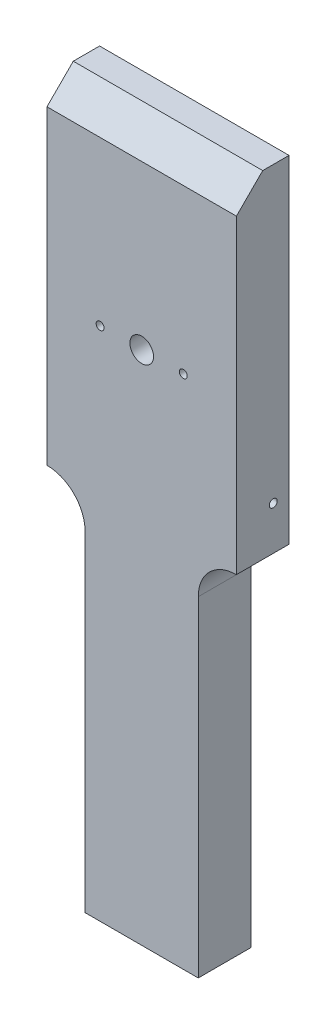
ISO-10303-21;
HEADER;
FILE_DESCRIPTION(('STEP AP214'),'2;1');
FILE_NAME('part.step','',(''),(''),'','','');
FILE_SCHEMA(('AUTOMOTIVE_DESIGN { 1 0 10303 214 1 1 1 1 }'));
ENDSEC;
DATA;
#1=APPLICATION_CONTEXT('core data for automotive mechanical design processes');
#2=APPLICATION_PROTOCOL_DEFINITION('international standard','automotive_design',2000,#1);
#3=PRODUCT_CONTEXT('',#1,'mechanical');
#4=PRODUCT('Part','Part','',(#3));
#5=PRODUCT_RELATED_PRODUCT_CATEGORY('part','',(#4));
#6=PRODUCT_DEFINITION_FORMATION('','',#4);
#7=PRODUCT_DEFINITION_CONTEXT('part definition',#1,'design');
#8=PRODUCT_DEFINITION('design','',#6,#7);
#9=PRODUCT_DEFINITION_SHAPE('','',#8);
#10=(LENGTH_UNIT() NAMED_UNIT(*) SI_UNIT(.MILLI.,.METRE.));
#11=(NAMED_UNIT(*) PLANE_ANGLE_UNIT() SI_UNIT($,.RADIAN.));
#12=(NAMED_UNIT(*) SI_UNIT($,.STERADIAN.) SOLID_ANGLE_UNIT());
#13=UNCERTAINTY_MEASURE_WITH_UNIT(LENGTH_MEASURE(1.E-05),#10,'distance_accuracy_value','');
#14=(GEOMETRIC_REPRESENTATION_CONTEXT(3) GLOBAL_UNCERTAINTY_ASSIGNED_CONTEXT((#13)) GLOBAL_UNIT_ASSIGNED_CONTEXT((#10,
#11,#12)) REPRESENTATION_CONTEXT('',''));
#15=CARTESIAN_POINT('',(0.,0.,0.));
#16=DIRECTION('',(0.,0.,1.));
#17=DIRECTION('',(1.,0.,0.));
#18=AXIS2_PLACEMENT_3D('',#15,#16,#17);
#19=CARTESIAN_POINT('',(0.,-647.7,63.5));
#20=DIRECTION('',(0.,1.,0.));
#21=DIRECTION('',(0.,0.,1.));
#22=AXIS2_PLACEMENT_3D('',#19,#20,#21);
#23=PLANE('',#22);
#24=DIRECTION('',(1.,0.,0.));
#25=VECTOR('',#24,1.);
#26=CARTESIAN_POINT('',(0.,-647.7,0.));
#27=LINE('',#26,#25);
#28=CARTESIAN_POINT('',(-68.2625,-647.7,0.));
#29=VERTEX_POINT('',#28);
#30=CARTESIAN_POINT('',(68.2625,-647.7,0.));
#31=VERTEX_POINT('',#30);
#32=EDGE_CURVE('E255',#29,#31,#27,.T.);
#33=ORIENTED_EDGE('',*,*,#32,.T.);
#34=DIRECTION('',(0.,0.,-1.));
#35=VECTOR('',#34,1.);
#36=CARTESIAN_POINT('',(68.2625,-647.7,63.5));
#37=LINE('',#36,#35);
#38=CARTESIAN_POINT('',(68.2625,-647.7,63.5));
#39=VERTEX_POINT('',#38);
#40=EDGE_CURVE('E265',#39,#31,#37,.T.);
#41=ORIENTED_EDGE('',*,*,#40,.F.);
#42=DIRECTION('',(1.,0.,0.));
#43=VECTOR('',#42,1.);
#44=CARTESIAN_POINT('',(0.,-647.7,63.5));
#45=LINE('',#44,#43);
#46=CARTESIAN_POINT('',(-68.2625,-647.7,63.5));
#47=VERTEX_POINT('',#46);
#48=EDGE_CURVE('E244',#47,#39,#45,.T.);
#49=ORIENTED_EDGE('',*,*,#48,.F.);
#50=DIRECTION('',(0.,0.,-1.));
#51=VECTOR('',#50,1.);
#52=CARTESIAN_POINT('',(-68.2625,-647.7,63.5));
#53=LINE('',#52,#51);
#54=EDGE_CURVE('E254',#47,#29,#53,.T.);
#55=ORIENTED_EDGE('',*,*,#54,.T.);
#56=EDGE_LOOP('',(#33,#41,#49,#55));
#57=FACE_BOUND('',#56,.T.);
#58=ADVANCED_FACE('F105',(#57),#23,.F.);
#59=CARTESIAN_POINT('',(68.2625,0.,63.5));
#60=DIRECTION('',(-1.,0.,0.));
#61=DIRECTION('',(0.,0.,1.));
#62=AXIS2_PLACEMENT_3D('',#59,#60,#61);
#63=PLANE('',#62);
#64=DIRECTION('',(0.,1.,0.));
#65=VECTOR('',#64,1.);
#66=CARTESIAN_POINT('',(68.2625,0.,0.));
#67=LINE('',#66,#65);
#68=CARTESIAN_POINT('',(68.2625,-249.2375,0.));
#69=VERTEX_POINT('',#68);
#70=EDGE_CURVE('E258',#31,#69,#67,.T.);
#71=ORIENTED_EDGE('',*,*,#70,.T.);
#72=DIRECTION('',(0.,0.,-1.));
#73=VECTOR('',#72,1.);
#74=CARTESIAN_POINT('',(68.2625,-249.2375,63.5));
#75=LINE('',#74,#73);
#76=CARTESIAN_POINT('',(68.2625,-249.2375,63.5));
#77=VERTEX_POINT('',#76);
#78=EDGE_CURVE('E268',#69,#77,#75,.F.);
#79=ORIENTED_EDGE('',*,*,#78,.T.);
#80=DIRECTION('',(0.,1.,0.));
#81=VECTOR('',#80,1.);
#82=CARTESIAN_POINT('',(68.2625,0.,63.5));
#83=LINE('',#82,#81);
#84=EDGE_CURVE('E247',#39,#77,#83,.T.);
#85=ORIENTED_EDGE('',*,*,#84,.F.);
#86=ORIENTED_EDGE('',*,*,#40,.T.);
#87=EDGE_LOOP('',(#71,#79,#85,#86));
#88=FACE_BOUND('',#87,.T.);
#89=ADVANCED_FACE('F397',(#88),#63,.F.);
#90=CARTESIAN_POINT('',(-68.2625,0.,63.5));
#91=DIRECTION('',(-1.,0.,0.));
#92=DIRECTION('',(0.,0.,1.));
#93=AXIS2_PLACEMENT_3D('',#90,#91,#92);
#94=PLANE('',#93);
#95=DIRECTION('',(0.,1.,0.));
#96=VECTOR('',#95,1.);
#97=CARTESIAN_POINT('',(-68.2625,0.,63.5));
#98=LINE('',#97,#96);
#99=CARTESIAN_POINT('',(-68.2625,-249.2375,63.5));
#100=VERTEX_POINT('',#99);
#101=EDGE_CURVE('E251',#47,#100,#98,.T.);
#102=ORIENTED_EDGE('',*,*,#101,.T.);
#103=DIRECTION('',(0.,0.,-1.));
#104=VECTOR('',#103,1.);
#105=CARTESIAN_POINT('',(-68.2625,-249.2375,0.));
#106=LINE('',#105,#104);
#107=CARTESIAN_POINT('',(-68.2625,-249.2375,0.));
#108=VERTEX_POINT('',#107);
#109=EDGE_CURVE('E313',#100,#108,#106,.T.);
#110=ORIENTED_EDGE('',*,*,#109,.T.);
#111=DIRECTION('',(0.,1.,0.));
#112=VECTOR('',#111,1.);
#113=CARTESIAN_POINT('',(-68.2625,0.,0.));
#114=LINE('',#113,#112);
#115=EDGE_CURVE('E248',#29,#108,#114,.T.);
#116=ORIENTED_EDGE('',*,*,#115,.F.);
#117=ORIENTED_EDGE('',*,*,#54,.F.);
#118=EDGE_LOOP('',(#102,#110,#116,#117));
#119=FACE_BOUND('',#118,.T.);
#120=ADVANCED_FACE('F344',(#119),#94,.T.);
#121=CARTESIAN_POINT('',(0.,0.,63.5));
#122=DIRECTION('',(0.,0.,1.));
#123=DIRECTION('',(1.,0.,0.));
#124=AXIS2_PLACEMENT_3D('',#121,#122,#123);
#125=PLANE('',#124);
#126=DIRECTION('',(0.,-1.,0.));
#127=VECTOR('',#126,1.);
#128=CARTESIAN_POINT('',(114.3,203.2,63.5));
#129=LINE('',#128,#127);
#130=CARTESIAN_POINT('',(114.3,171.45,63.5));
#131=VERTEX_POINT('',#130);
#132=CARTESIAN_POINT('',(114.3,-203.2,63.5));
#133=VERTEX_POINT('',#132);
#134=EDGE_CURVE('E289',#131,#133,#129,.T.);
#135=ORIENTED_EDGE('',*,*,#134,.F.);
#136=DIRECTION('',(-1.,0.,0.));
#137=VECTOR('',#136,1.);
#138=CARTESIAN_POINT('',(-114.3,171.45,63.5));
#139=LINE('',#138,#137);
#140=CARTESIAN_POINT('',(-114.3,171.45,63.5));
#141=VERTEX_POINT('',#140);
#142=EDGE_CURVE('E325',#131,#141,#139,.T.);
#143=ORIENTED_EDGE('',*,*,#142,.T.);
#144=DIRECTION('',(0.,-1.,0.));
#145=VECTOR('',#144,1.);
#146=CARTESIAN_POINT('',(-114.3,203.2,63.5));
#147=LINE('',#146,#145);
#148=CARTESIAN_POINT('',(-114.3,-203.2,63.5));
#149=VERTEX_POINT('',#148);
#150=EDGE_CURVE('E287',#141,#149,#147,.T.);
#151=ORIENTED_EDGE('',*,*,#150,.T.);
#152=CARTESIAN_POINT('',(-114.3,-249.2375,63.5));
#153=DIRECTION('',(0.,0.,1.));
#154=DIRECTION('',(1.,0.,0.));
#155=AXIS2_PLACEMENT_3D('',#152,#153,#154);
#156=CIRCLE('',#155,46.0375);
#157=EDGE_CURVE('E323',#149,#100,#156,.F.);
#158=ORIENTED_EDGE('',*,*,#157,.T.);
#159=ORIENTED_EDGE('',*,*,#101,.F.);
#160=ORIENTED_EDGE('',*,*,#48,.T.);
#161=ORIENTED_EDGE('',*,*,#84,.T.);
#162=CARTESIAN_POINT('',(114.3,-249.2375,63.5));
#163=DIRECTION('',(0.,0.,1.));
#164=DIRECTION('',(1.,0.,0.));
#165=AXIS2_PLACEMENT_3D('',#162,#163,#164);
#166=CIRCLE('',#165,46.0375);
#167=EDGE_CURVE('E318',#77,#133,#166,.F.);
#168=ORIENTED_EDGE('',*,*,#167,.T.);
#169=EDGE_LOOP('',(#135,#143,#151,#158,#159,#160,#161,#168));
#170=FACE_BOUND('',#169,.T.);
#171=CARTESIAN_POINT('',(-50.1740938230278,-25.3999999999999,63.5));
#172=DIRECTION('',(0.,0.,1.));
#173=DIRECTION('',(1.,0.,0.));
#174=AXIS2_PLACEMENT_3D('',#171,#172,#173);
#175=CIRCLE('',#174,4.7625);
#176=CARTESIAN_POINT('',(-45.4115938230278,-25.3999999999999,63.5));
#177=VERTEX_POINT('',#176);
#178=EDGE_CURVE('E275',#177,#177,#175,.T.);
#179=ORIENTED_EDGE('',*,*,#178,.F.);
#180=EDGE_LOOP('',(#179));
#181=FACE_BOUND('',#180,.T.);
#182=CARTESIAN_POINT('',(0.,-25.3999999999999,63.5));
#183=DIRECTION('',(0.,0.,1.));
#184=DIRECTION('',(1.,0.,0.));
#185=AXIS2_PLACEMENT_3D('',#182,#183,#184);
#186=CIRCLE('',#185,14.2875);
#187=CARTESIAN_POINT('',(14.2875,-25.3999999999999,63.5));
#188=VERTEX_POINT('',#187);
#189=EDGE_CURVE('E281',#188,#188,#186,.T.);
#190=ORIENTED_EDGE('',*,*,#189,.F.);
#191=EDGE_LOOP('',(#190));
#192=FACE_BOUND('',#191,.T.);
#193=CARTESIAN_POINT('',(50.1740938230278,-25.3999999999999,63.5));
#194=DIRECTION('',(0.,0.,1.));
#195=DIRECTION('',(1.,0.,0.));
#196=AXIS2_PLACEMENT_3D('',#193,#194,#195);
#197=CIRCLE('',#196,4.7625);
#198=CARTESIAN_POINT('',(54.9365938230278,-25.3999999999999,63.5));
#199=VERTEX_POINT('',#198);
#200=EDGE_CURVE('E269',#199,#199,#197,.T.);
#201=ORIENTED_EDGE('',*,*,#200,.F.);
#202=EDGE_LOOP('',(#201));
#203=FACE_BOUND('',#202,.T.);
#204=ADVANCED_FACE('F331',(#170,#181,#192,#203),#125,.T.);
#205=CARTESIAN_POINT('',(0.,0.,0.));
#206=DIRECTION('',(0.,0.,1.));
#207=DIRECTION('',(1.,0.,0.));
#208=AXIS2_PLACEMENT_3D('',#205,#206,#207);
#209=PLANE('',#208);
#210=DIRECTION('',(1.,0.,0.));
#211=VECTOR('',#210,1.);
#212=CARTESIAN_POINT('',(19.0499999999999,-128.5875,0.));
#213=LINE('',#212,#211);
#214=CARTESIAN_POINT('',(-19.0500000000001,-128.5875,0.));
#215=VERTEX_POINT('',#214);
#216=CARTESIAN_POINT('',(19.0499999999999,-128.5875,0.));
#217=VERTEX_POINT('',#216);
#218=EDGE_CURVE('E234',#215,#217,#213,.T.);
#219=ORIENTED_EDGE('',*,*,#218,.F.);
#220=DIRECTION('',(0.,1.,0.));
#221=VECTOR('',#220,1.);
#222=CARTESIAN_POINT('',(-19.0500000000001,-128.5875,0.));
#223=LINE('',#222,#221);
#224=CARTESIAN_POINT('',(-19.0500000000002,-623.8875,0.));
#225=VERTEX_POINT('',#224);
#226=EDGE_CURVE('E205',#225,#215,#223,.T.);
#227=ORIENTED_EDGE('',*,*,#226,.F.);
#228=DIRECTION('',(-1.,0.,0.));
#229=VECTOR('',#228,1.);
#230=CARTESIAN_POINT('',(19.0499999999998,-623.8875,0.));
#231=LINE('',#230,#229);
#232=CARTESIAN_POINT('',(19.0499999999998,-623.8875,0.));
#233=VERTEX_POINT('',#232);
#234=EDGE_CURVE('E222',#233,#225,#231,.T.);
#235=ORIENTED_EDGE('',*,*,#234,.F.);
#236=DIRECTION('',(0.,-1.,0.));
#237=VECTOR('',#236,1.);
#238=CARTESIAN_POINT('',(19.0499999999999,-128.5875,0.));
#239=LINE('',#238,#237);
#240=EDGE_CURVE('E225',#217,#233,#239,.T.);
#241=ORIENTED_EDGE('',*,*,#240,.F.);
#242=EDGE_LOOP('',(#219,#227,#235,#241));
#243=FACE_BOUND('',#242,.T.);
#244=ORIENTED_EDGE('',*,*,#32,.F.);
#245=ORIENTED_EDGE('',*,*,#115,.T.);
#246=CARTESIAN_POINT('',(-114.3,-249.2375,0.));
#247=DIRECTION('',(0.,0.,1.));
#248=DIRECTION('',(1.,0.,0.));
#249=AXIS2_PLACEMENT_3D('',#246,#247,#248);
#250=CIRCLE('',#249,46.0375);
#251=CARTESIAN_POINT('',(-114.3,-203.2,0.));
#252=VERTEX_POINT('',#251);
#253=EDGE_CURVE('E321',#108,#252,#250,.T.);
#254=ORIENTED_EDGE('',*,*,#253,.T.);
#255=DIRECTION('',(0.,-1.,0.));
#256=VECTOR('',#255,1.);
#257=CARTESIAN_POINT('',(-114.3,203.2,0.));
#258=LINE('',#257,#256);
#259=CARTESIAN_POINT('',(-114.3,203.2,0.));
#260=VERTEX_POINT('',#259);
#261=EDGE_CURVE('E295',#260,#252,#258,.T.);
#262=ORIENTED_EDGE('',*,*,#261,.F.);
#263=DIRECTION('',(-1.,0.,0.));
#264=VECTOR('',#263,1.);
#265=CARTESIAN_POINT('',(114.3,203.2,0.));
#266=LINE('',#265,#264);
#267=CARTESIAN_POINT('',(114.3,203.2,0.));
#268=VERTEX_POINT('',#267);
#269=EDGE_CURVE('E284',#268,#260,#266,.T.);
#270=ORIENTED_EDGE('',*,*,#269,.F.);
#271=DIRECTION('',(0.,-1.,0.));
#272=VECTOR('',#271,1.);
#273=CARTESIAN_POINT('',(114.3,203.2,0.));
#274=LINE('',#273,#272);
#275=CARTESIAN_POINT('',(114.3,-203.2,0.));
#276=VERTEX_POINT('',#275);
#277=EDGE_CURVE('E290',#268,#276,#274,.T.);
#278=ORIENTED_EDGE('',*,*,#277,.T.);
#279=CARTESIAN_POINT('',(114.3,-249.2375,0.));
#280=DIRECTION('',(0.,0.,1.));
#281=DIRECTION('',(1.,0.,0.));
#282=AXIS2_PLACEMENT_3D('',#279,#280,#281);
#283=CIRCLE('',#282,46.0375);
#284=EDGE_CURVE('E316',#276,#69,#283,.T.);
#285=ORIENTED_EDGE('',*,*,#284,.T.);
#286=ORIENTED_EDGE('',*,*,#70,.F.);
#287=EDGE_LOOP('',(#244,#245,#254,#262,#270,#278,#285,#286));
#288=FACE_BOUND('',#287,.T.);
#289=CARTESIAN_POINT('',(0.,-25.3999999999999,0.));
#290=DIRECTION('',(0.,0.,1.));
#291=DIRECTION('',(1.,0.,0.));
#292=AXIS2_PLACEMENT_3D('',#289,#290,#291);
#293=CIRCLE('',#292,14.2875);
#294=CARTESIAN_POINT('',(14.2875,-25.3999999999999,0.));
#295=VERTEX_POINT('',#294);
#296=EDGE_CURVE('E278',#295,#295,#293,.T.);
#297=ORIENTED_EDGE('',*,*,#296,.T.);
#298=EDGE_LOOP('',(#297));
#299=FACE_BOUND('',#298,.T.);
#300=CARTESIAN_POINT('',(-50.1740938230278,-25.3999999999999,0.));
#301=DIRECTION('',(0.,0.,1.));
#302=DIRECTION('',(1.,0.,0.));
#303=AXIS2_PLACEMENT_3D('',#300,#301,#302);
#304=CIRCLE('',#303,4.7625);
#305=CARTESIAN_POINT('',(-45.4115938230278,-25.3999999999999,0.));
#306=VERTEX_POINT('',#305);
#307=EDGE_CURVE('E272',#306,#306,#304,.T.);
#308=ORIENTED_EDGE('',*,*,#307,.T.);
#309=EDGE_LOOP('',(#308));
#310=FACE_BOUND('',#309,.T.);
#311=CARTESIAN_POINT('',(50.1740938230278,-25.3999999999999,0.));
#312=DIRECTION('',(0.,0.,1.));
#313=DIRECTION('',(1.,0.,0.));
#314=AXIS2_PLACEMENT_3D('',#311,#312,#313);
#315=CIRCLE('',#314,4.7625);
#316=CARTESIAN_POINT('',(54.9365938230278,-25.3999999999999,0.));
#317=VERTEX_POINT('',#316);
#318=EDGE_CURVE('E240',#317,#317,#315,.T.);
#319=ORIENTED_EDGE('',*,*,#318,.T.);
#320=EDGE_LOOP('',(#319));
#321=FACE_BOUND('',#320,.T.);
#322=ADVANCED_FACE('F361',(#243,#288,#299,#310,#321),#209,.F.);
#323=CARTESIAN_POINT('',(50.1740938230278,-25.3999999999999,63.5));
#324=DIRECTION('',(0.,0.,-1.));
#325=DIRECTION('',(-1.,0.,0.));
#326=AXIS2_PLACEMENT_3D('',#323,#324,#325);
#327=CYLINDRICAL_SURFACE('',#326,4.7625);
#328=ORIENTED_EDGE('',*,*,#200,.T.);
#329=EDGE_LOOP('',(#328));
#330=FACE_BOUND('',#329,.T.);
#331=ORIENTED_EDGE('',*,*,#318,.F.);
#332=EDGE_LOOP('',(#331));
#333=FACE_BOUND('',#332,.T.);
#334=ADVANCED_FACE('F378',(#330,#333),#327,.F.);
#335=CARTESIAN_POINT('',(0.,-25.3999999999999,63.5));
#336=DIRECTION('',(0.,0.,-1.));
#337=DIRECTION('',(-1.,0.,0.));
#338=AXIS2_PLACEMENT_3D('',#335,#336,#337);
#339=CYLINDRICAL_SURFACE('',#338,14.2875);
#340=ORIENTED_EDGE('',*,*,#189,.T.);
#341=EDGE_LOOP('',(#340));
#342=FACE_BOUND('',#341,.T.);
#343=ORIENTED_EDGE('',*,*,#296,.F.);
#344=EDGE_LOOP('',(#343));
#345=FACE_BOUND('',#344,.T.);
#346=ADVANCED_FACE('F370',(#342,#345),#339,.F.);
#347=CARTESIAN_POINT('',(114.3,203.2,63.5));
#348=DIRECTION('',(0.,-1.,0.));
#349=DIRECTION('',(1.,0.,0.));
#350=AXIS2_PLACEMENT_3D('',#347,#348,#349);
#351=PLANE('',#350);
#352=DIRECTION('',(0.,0.,-1.));
#353=VECTOR('',#352,1.);
#354=CARTESIAN_POINT('',(-114.3,203.2,63.5));
#355=LINE('',#354,#353);
#356=CARTESIAN_POINT('',(-114.3,203.2,31.7499999999998));
#357=VERTEX_POINT('',#356);
#358=EDGE_CURVE('E259',#357,#260,#355,.T.);
#359=ORIENTED_EDGE('',*,*,#358,.F.);
#360=DIRECTION('',(1.,0.,0.));
#361=VECTOR('',#360,1.);
#362=CARTESIAN_POINT('',(114.3,203.2,31.7499999999998));
#363=LINE('',#362,#361);
#364=CARTESIAN_POINT('',(114.3,203.2,31.7499999999998));
#365=VERTEX_POINT('',#364);
#366=EDGE_CURVE('E113',#357,#365,#363,.T.);
#367=ORIENTED_EDGE('',*,*,#366,.T.);
#368=DIRECTION('',(0.,0.,-1.));
#369=VECTOR('',#368,1.);
#370=CARTESIAN_POINT('',(114.3,203.2,63.5));
#371=LINE('',#370,#369);
#372=EDGE_CURVE('E292',#365,#268,#371,.T.);
#373=ORIENTED_EDGE('',*,*,#372,.T.);
#374=ORIENTED_EDGE('',*,*,#269,.T.);
#375=EDGE_LOOP('',(#359,#367,#373,#374));
#376=FACE_BOUND('',#375,.T.);
#377=ADVANCED_FACE('F363',(#376),#351,.F.);
#378=CARTESIAN_POINT('',(-50.1740938230278,-25.3999999999999,63.5));
#379=DIRECTION('',(0.,0.,-1.));
#380=DIRECTION('',(-1.,0.,0.));
#381=AXIS2_PLACEMENT_3D('',#378,#379,#380);
#382=CYLINDRICAL_SURFACE('',#381,4.7625);
#383=ORIENTED_EDGE('',*,*,#178,.T.);
#384=EDGE_LOOP('',(#383));
#385=FACE_BOUND('',#384,.T.);
#386=ORIENTED_EDGE('',*,*,#307,.F.);
#387=EDGE_LOOP('',(#386));
#388=FACE_BOUND('',#387,.T.);
#389=ADVANCED_FACE('F369',(#385,#388),#382,.F.);
#390=CARTESIAN_POINT('',(-114.3,203.2,63.5));
#391=DIRECTION('',(1.,0.,0.));
#392=DIRECTION('',(0.,1.,0.));
#393=AXIS2_PLACEMENT_3D('',#390,#391,#392);
#394=PLANE('',#393);
#395=CARTESIAN_POINT('',(-114.3,-150.8125,19.05));
#396=DIRECTION('',(-1.,0.,0.));
#397=DIRECTION('',(0.,-1.,0.));
#398=AXIS2_PLACEMENT_3D('',#395,#396,#397);
#399=CIRCLE('',#398,4.7625);
#400=CARTESIAN_POINT('',(-114.3,-155.575,19.05));
#401=VERTEX_POINT('',#400);
#402=EDGE_CURVE('E433',#401,#401,#399,.T.);
#403=ORIENTED_EDGE('',*,*,#402,.F.);
#404=EDGE_LOOP('',(#403));
#405=FACE_BOUND('',#404,.T.);
#406=ORIENTED_EDGE('',*,*,#150,.F.);
#407=DIRECTION('',(0.,0.707106781186546,-0.707106781186549));
#408=VECTOR('',#407,1.);
#409=CARTESIAN_POINT('',(-114.3,171.45,63.5));
#410=LINE('',#409,#408);
#411=EDGE_CURVE('E127',#141,#357,#410,.T.);
#412=ORIENTED_EDGE('',*,*,#411,.T.);
#413=ORIENTED_EDGE('',*,*,#358,.T.);
#414=ORIENTED_EDGE('',*,*,#261,.T.);
#415=DIRECTION('',(0.,0.,-1.));
#416=VECTOR('',#415,1.);
#417=CARTESIAN_POINT('',(-114.3,-203.2,63.5));
#418=LINE('',#417,#416);
#419=EDGE_CURVE('E304',#149,#252,#418,.T.);
#420=ORIENTED_EDGE('',*,*,#419,.F.);
#421=EDGE_LOOP('',(#406,#412,#413,#414,#420));
#422=FACE_BOUND('',#421,.T.);
#423=ADVANCED_FACE('F336',(#405,#422),#394,.F.);
#424=CARTESIAN_POINT('',(114.3,203.2,63.5));
#425=DIRECTION('',(1.,0.,0.));
#426=DIRECTION('',(0.,1.,0.));
#427=AXIS2_PLACEMENT_3D('',#424,#425,#426);
#428=PLANE('',#427);
#429=CARTESIAN_POINT('',(114.3,-150.8125,19.05));
#430=DIRECTION('',(-1.,0.,0.));
#431=DIRECTION('',(0.,-1.,0.));
#432=AXIS2_PLACEMENT_3D('',#429,#430,#431);
#433=CIRCLE('',#432,4.7625);
#434=CARTESIAN_POINT('',(114.3,-155.575,19.05));
#435=VERTEX_POINT('',#434);
#436=EDGE_CURVE('E311',#435,#435,#433,.T.);
#437=ORIENTED_EDGE('',*,*,#436,.T.);
#438=EDGE_LOOP('',(#437));
#439=FACE_BOUND('',#438,.T.);
#440=ORIENTED_EDGE('',*,*,#372,.F.);
#441=DIRECTION('',(0.,-0.707106781186546,0.707106781186549));
#442=VECTOR('',#441,1.);
#443=CARTESIAN_POINT('',(114.3,187.325,47.625));
#444=LINE('',#443,#442);
#445=EDGE_CURVE('E12',#365,#131,#444,.T.);
#446=ORIENTED_EDGE('',*,*,#445,.T.);
#447=ORIENTED_EDGE('',*,*,#134,.T.);
#448=DIRECTION('',(0.,0.,-1.));
#449=VECTOR('',#448,1.);
#450=CARTESIAN_POINT('',(114.3,-203.2,63.5));
#451=LINE('',#450,#449);
#452=EDGE_CURVE('E301',#133,#276,#451,.T.);
#453=ORIENTED_EDGE('',*,*,#452,.T.);
#454=ORIENTED_EDGE('',*,*,#277,.F.);
#455=EDGE_LOOP('',(#440,#446,#447,#453,#454));
#456=FACE_BOUND('',#455,.T.);
#457=ADVANCED_FACE('F358',(#439,#456),#428,.T.);
#458=CARTESIAN_POINT('',(-19.0500000000001,-128.5875,36.5125));
#459=DIRECTION('',(-1.,0.,0.));
#460=DIRECTION('',(0.,-1.,0.));
#461=AXIS2_PLACEMENT_3D('',#458,#459,#460);
#462=PLANE('',#461);
#463=CARTESIAN_POINT('',(-19.0500000000001,-150.8125,19.05));
#464=DIRECTION('',(-1.,0.,0.));
#465=DIRECTION('',(0.,-1.,0.));
#466=AXIS2_PLACEMENT_3D('',#463,#464,#465);
#467=CIRCLE('',#466,4.7625);
#468=CARTESIAN_POINT('',(-19.0500000000001,-155.575,19.05));
#469=VERTEX_POINT('',#468);
#470=EDGE_CURVE('E228',#469,#469,#467,.T.);
#471=ORIENTED_EDGE('',*,*,#470,.T.);
#472=EDGE_LOOP('',(#471));
#473=FACE_BOUND('',#472,.T.);
#474=ORIENTED_EDGE('',*,*,#226,.T.);
#475=DIRECTION('',(0.,0.,-1.));
#476=VECTOR('',#475,1.);
#477=CARTESIAN_POINT('',(-19.0500000000001,-128.5875,36.5125));
#478=LINE('',#477,#476);
#479=CARTESIAN_POINT('',(-19.0500000000001,-128.5875,36.5125));
#480=VERTEX_POINT('',#479);
#481=EDGE_CURVE('E198',#480,#215,#478,.T.);
#482=ORIENTED_EDGE('',*,*,#481,.F.);
#483=DIRECTION('',(0.,1.,0.));
#484=VECTOR('',#483,1.);
#485=CARTESIAN_POINT('',(-19.0500000000001,-128.5875,36.5125));
#486=LINE('',#485,#484);
#487=CARTESIAN_POINT('',(-19.0500000000002,-623.8875,36.5125));
#488=VERTEX_POINT('',#487);
#489=EDGE_CURVE('E202',#488,#480,#486,.T.);
#490=ORIENTED_EDGE('',*,*,#489,.F.);
#491=DIRECTION('',(0.,0.,-1.));
#492=VECTOR('',#491,1.);
#493=CARTESIAN_POINT('',(-19.0500000000002,-623.8875,36.5125));
#494=LINE('',#493,#492);
#495=EDGE_CURVE('E238',#488,#225,#494,.T.);
#496=ORIENTED_EDGE('',*,*,#495,.T.);
#497=EDGE_LOOP('',(#474,#482,#490,#496));
#498=FACE_BOUND('',#497,.T.);
#499=ADVANCED_FACE('F200',(#473,#498),#462,.F.);
#500=CARTESIAN_POINT('',(19.0499999999998,-623.8875,36.5125));
#501=DIRECTION('',(0.,-1.,0.));
#502=DIRECTION('',(0.,0.,-1.));
#503=AXIS2_PLACEMENT_3D('',#500,#501,#502);
#504=PLANE('',#503);
#505=ORIENTED_EDGE('',*,*,#234,.T.);
#506=ORIENTED_EDGE('',*,*,#495,.F.);
#507=DIRECTION('',(-1.,0.,0.));
#508=VECTOR('',#507,1.);
#509=CARTESIAN_POINT('',(19.0499999999998,-623.8875,36.5125));
#510=LINE('',#509,#508);
#511=CARTESIAN_POINT('',(19.0499999999998,-623.8875,36.5125));
#512=VERTEX_POINT('',#511);
#513=EDGE_CURVE('E210',#512,#488,#510,.T.);
#514=ORIENTED_EDGE('',*,*,#513,.F.);
#515=DIRECTION('',(0.,0.,-1.));
#516=VECTOR('',#515,1.);
#517=CARTESIAN_POINT('',(19.0499999999998,-623.8875,36.5125));
#518=LINE('',#517,#516);
#519=EDGE_CURVE('E241',#512,#233,#518,.T.);
#520=ORIENTED_EDGE('',*,*,#519,.T.);
#521=EDGE_LOOP('',(#505,#506,#514,#520));
#522=FACE_BOUND('',#521,.T.);
#523=ADVANCED_FACE('F409',(#522),#504,.F.);
#524=CARTESIAN_POINT('',(19.0499999999999,-128.5875,36.5125));
#525=DIRECTION('',(1.,0.,0.));
#526=DIRECTION('',(0.,1.,0.));
#527=AXIS2_PLACEMENT_3D('',#524,#525,#526);
#528=PLANE('',#527);
#529=CARTESIAN_POINT('',(19.0499999999999,-150.8125,19.05));
#530=DIRECTION('',(1.,0.,0.));
#531=DIRECTION('',(0.,1.,0.));
#532=AXIS2_PLACEMENT_3D('',#529,#530,#531);
#533=CIRCLE('',#532,4.7625);
#534=CARTESIAN_POINT('',(19.0499999999999,-146.05,19.05));
#535=VERTEX_POINT('',#534);
#536=EDGE_CURVE('E308',#535,#535,#533,.T.);
#537=ORIENTED_EDGE('',*,*,#536,.T.);
#538=EDGE_LOOP('',(#537));
#539=FACE_BOUND('',#538,.T.);
#540=ORIENTED_EDGE('',*,*,#240,.T.);
#541=ORIENTED_EDGE('',*,*,#519,.F.);
#542=DIRECTION('',(0.,-1.,0.));
#543=VECTOR('',#542,1.);
#544=CARTESIAN_POINT('',(19.0499999999999,-128.5875,36.5125));
#545=LINE('',#544,#543);
#546=CARTESIAN_POINT('',(19.0499999999999,-128.5875,36.5125));
#547=VERTEX_POINT('',#546);
#548=EDGE_CURVE('E218',#547,#512,#545,.T.);
#549=ORIENTED_EDGE('',*,*,#548,.F.);
#550=DIRECTION('',(0.,0.,-1.));
#551=VECTOR('',#550,1.);
#552=CARTESIAN_POINT('',(19.0499999999999,-128.5875,36.5125));
#553=LINE('',#552,#551);
#554=EDGE_CURVE('E209',#547,#217,#553,.T.);
#555=ORIENTED_EDGE('',*,*,#554,.T.);
#556=EDGE_LOOP('',(#540,#541,#549,#555));
#557=FACE_BOUND('',#556,.T.);
#558=ADVANCED_FACE('F413',(#539,#557),#528,.F.);
#559=CARTESIAN_POINT('',(19.0499999999999,-128.5875,36.5125));
#560=DIRECTION('',(0.,1.,0.));
#561=DIRECTION('',(0.,0.,1.));
#562=AXIS2_PLACEMENT_3D('',#559,#560,#561);
#563=PLANE('',#562);
#564=ORIENTED_EDGE('',*,*,#218,.T.);
#565=ORIENTED_EDGE('',*,*,#554,.F.);
#566=DIRECTION('',(1.,0.,0.));
#567=VECTOR('',#566,1.);
#568=CARTESIAN_POINT('',(19.0499999999999,-128.5875,36.5125));
#569=LINE('',#568,#567);
#570=EDGE_CURVE('E213',#480,#547,#569,.T.);
#571=ORIENTED_EDGE('',*,*,#570,.F.);
#572=ORIENTED_EDGE('',*,*,#481,.T.);
#573=EDGE_LOOP('',(#564,#565,#571,#572));
#574=FACE_BOUND('',#573,.T.);
#575=ADVANCED_FACE('F214',(#574),#563,.F.);
#576=CARTESIAN_POINT('',(0.,0.,36.5125));
#577=DIRECTION('',(0.,0.,-1.));
#578=DIRECTION('',(-1.,0.,0.));
#579=AXIS2_PLACEMENT_3D('',#576,#577,#578);
#580=PLANE('',#579);
#581=ORIENTED_EDGE('',*,*,#489,.T.);
#582=ORIENTED_EDGE('',*,*,#570,.T.);
#583=ORIENTED_EDGE('',*,*,#548,.T.);
#584=ORIENTED_EDGE('',*,*,#513,.T.);
#585=EDGE_LOOP('',(#581,#582,#583,#584));
#586=FACE_BOUND('',#585,.T.);
#587=ADVANCED_FACE('F220',(#586),#580,.T.);
#588=CARTESIAN_POINT('',(114.3,-150.8125,19.05));
#589=DIRECTION('',(-1.,0.,0.));
#590=DIRECTION('',(0.,-1.,0.));
#591=AXIS2_PLACEMENT_3D('',#588,#589,#590);
#592=CYLINDRICAL_SURFACE('',#591,4.7625);
#593=ORIENTED_EDGE('',*,*,#436,.F.);
#594=EDGE_LOOP('',(#593));
#595=FACE_BOUND('',#594,.T.);
#596=ORIENTED_EDGE('',*,*,#536,.F.);
#597=EDGE_LOOP('',(#596));
#598=FACE_BOUND('',#597,.T.);
#599=ADVANCED_FACE('F422',(#595,#598),#592,.F.);
#600=ORIENTED_EDGE('',*,*,#402,.T.);
#601=EDGE_LOOP('',(#600));
#602=FACE_BOUND('',#601,.T.);
#603=ORIENTED_EDGE('',*,*,#470,.F.);
#604=EDGE_LOOP('',(#603));
#605=FACE_BOUND('',#604,.T.);
#606=ADVANCED_FACE('F423',(#602,#605),#592,.F.);
#607=CARTESIAN_POINT('',(114.3,-249.2375,63.5));
#608=DIRECTION('',(0.,0.,-1.));
#609=DIRECTION('',(-1.,0.,0.));
#610=AXIS2_PLACEMENT_3D('',#607,#608,#609);
#611=CYLINDRICAL_SURFACE('',#610,46.0375);
#612=ORIENTED_EDGE('',*,*,#167,.F.);
#613=ORIENTED_EDGE('',*,*,#78,.F.);
#614=ORIENTED_EDGE('',*,*,#284,.F.);
#615=ORIENTED_EDGE('',*,*,#452,.F.);
#616=EDGE_LOOP('',(#612,#613,#614,#615));
#617=FACE_BOUND('',#616,.T.);
#618=ADVANCED_FACE('F355',(#617),#611,.F.);
#619=CARTESIAN_POINT('',(-114.3,-249.2375,63.5));
#620=DIRECTION('',(0.,0.,1.));
#621=DIRECTION('',(1.,0.,0.));
#622=AXIS2_PLACEMENT_3D('',#619,#620,#621);
#623=CYLINDRICAL_SURFACE('',#622,46.0375);
#624=ORIENTED_EDGE('',*,*,#157,.F.);
#625=ORIENTED_EDGE('',*,*,#419,.T.);
#626=ORIENTED_EDGE('',*,*,#253,.F.);
#627=ORIENTED_EDGE('',*,*,#109,.F.);
#628=EDGE_LOOP('',(#624,#625,#626,#627));
#629=FACE_BOUND('',#628,.T.);
#630=ADVANCED_FACE('F341',(#629),#623,.F.);
#631=CARTESIAN_POINT('',(0.,171.45,63.5));
#632=DIRECTION('',(0.,0.707106781186549,0.707106781186546));
#633=DIRECTION('',(1.,0.,0.));
#634=AXIS2_PLACEMENT_3D('',#631,#632,#633);
#635=PLANE('',#634);
#636=ORIENTED_EDGE('',*,*,#445,.F.);
#637=ORIENTED_EDGE('',*,*,#366,.F.);
#638=ORIENTED_EDGE('',*,*,#411,.F.);
#639=ORIENTED_EDGE('',*,*,#142,.F.);
#640=EDGE_LOOP('',(#636,#637,#638,#639));
#641=FACE_BOUND('',#640,.T.);
#642=ADVANCED_FACE('F107',(#641),#635,.T.);
#643=CLOSED_SHELL('',(#58,#89,#120,#204,#322,#334,#346,#377,#389,#423,#457,#499,#523,#558,#575,
#587,#599,#606,#618,#630,#642));
#644=MANIFOLD_SOLID_BREP('B2',#643);
#645=ADVANCED_BREP_SHAPE_REPRESENTATION('',(#18,#644),#14);
#646=SHAPE_DEFINITION_REPRESENTATION(#9,#645);
ENDSEC;
END-ISO-10303-21;
